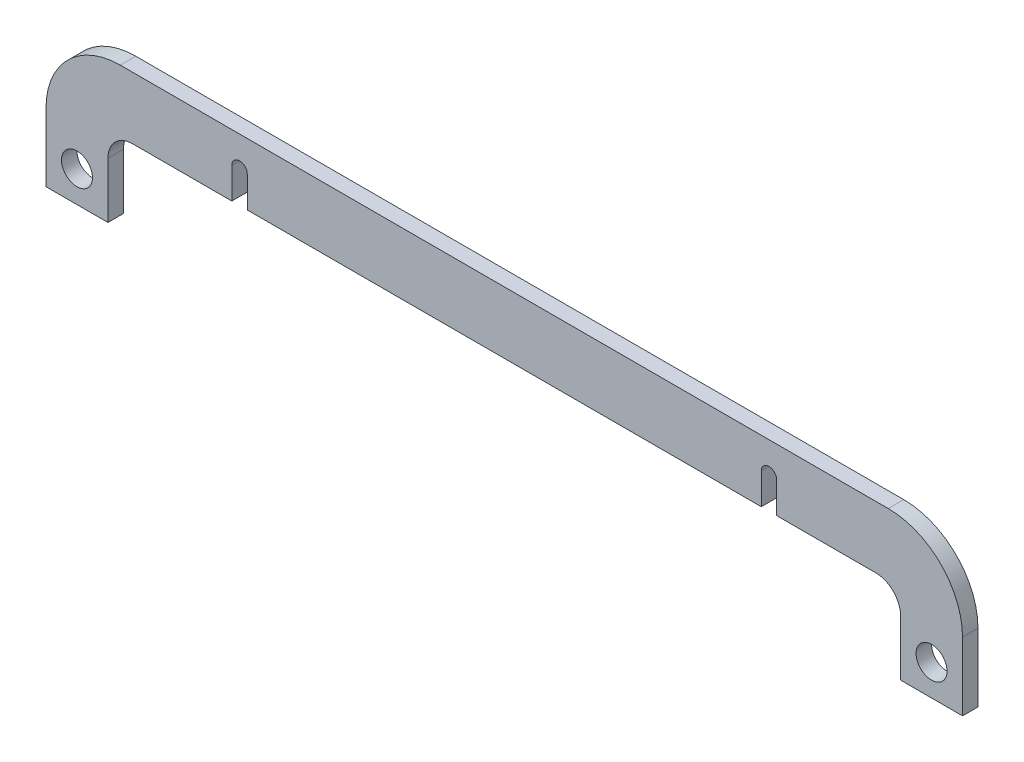
ISO-10303-21;
HEADER;
FILE_DESCRIPTION(('STEP AP214'),'2;1');
FILE_NAME('part.step','',(''),(''),'','','');
FILE_SCHEMA(('AUTOMOTIVE_DESIGN { 1 0 10303 214 1 1 1 1 }'));
ENDSEC;
DATA;
#1=APPLICATION_CONTEXT('core data for automotive mechanical design processes');
#2=APPLICATION_PROTOCOL_DEFINITION('international standard','automotive_design',2000,#1);
#3=PRODUCT_CONTEXT('',#1,'mechanical');
#4=PRODUCT('Part','Part','',(#3));
#5=PRODUCT_RELATED_PRODUCT_CATEGORY('part','',(#4));
#6=PRODUCT_DEFINITION_FORMATION('','',#4);
#7=PRODUCT_DEFINITION_CONTEXT('part definition',#1,'design');
#8=PRODUCT_DEFINITION('design','',#6,#7);
#9=PRODUCT_DEFINITION_SHAPE('','',#8);
#10=(LENGTH_UNIT() NAMED_UNIT(*) SI_UNIT(.MILLI.,.METRE.));
#11=(NAMED_UNIT(*) PLANE_ANGLE_UNIT() SI_UNIT($,.RADIAN.));
#12=(NAMED_UNIT(*) SI_UNIT($,.STERADIAN.) SOLID_ANGLE_UNIT());
#13=UNCERTAINTY_MEASURE_WITH_UNIT(LENGTH_MEASURE(1.E-05),#10,'distance_accuracy_value','');
#14=(GEOMETRIC_REPRESENTATION_CONTEXT(3) GLOBAL_UNCERTAINTY_ASSIGNED_CONTEXT((#13)) GLOBAL_UNIT_ASSIGNED_CONTEXT((#10,
#11,#12)) REPRESENTATION_CONTEXT('',''));
#15=CARTESIAN_POINT('',(0.,0.,0.));
#16=DIRECTION('',(0.,0.,1.));
#17=DIRECTION('',(1.,0.,0.));
#18=AXIS2_PLACEMENT_3D('',#15,#16,#17);
#19=CARTESIAN_POINT('',(27.14625,31.75,1.5875));
#20=DIRECTION('',(0.,0.,1.));
#21=DIRECTION('',(1.,0.,0.));
#22=AXIS2_PLACEMENT_3D('',#19,#20,#21);
#23=PLANE('',#22);
#24=CARTESIAN_POINT('',(-43.815,23.495,1.5875));
#25=DIRECTION('',(0.,0.,1.));
#26=DIRECTION('',(1.,0.,0.));
#27=AXIS2_PLACEMENT_3D('',#24,#25,#26);
#28=CIRCLE('',#27,1.5875);
#29=CARTESIAN_POINT('',(-42.2275,23.495,1.5875));
#30=VERTEX_POINT('',#29);
#31=EDGE_CURVE('E219',#30,#30,#28,.T.);
#32=ORIENTED_EDGE('',*,*,#31,.F.);
#33=EDGE_LOOP('',(#32));
#34=FACE_BOUND('',#33,.T.);
#35=DIRECTION('',(1.,0.,0.));
#36=VECTOR('',#35,1.);
#37=CARTESIAN_POINT('',(-26.3525,28.575,1.5875));
#38=LINE('',#37,#36);
#39=CARTESIAN_POINT('',(-26.3525,28.575,1.5875));
#40=VERTEX_POINT('',#39);
#41=CARTESIAN_POINT('',(26.3525,28.575,1.5875));
#42=VERTEX_POINT('',#41);
#43=EDGE_CURVE('E273',#40,#42,#38,.T.);
#44=ORIENTED_EDGE('',*,*,#43,.T.);
#45=DIRECTION('',(0.,1.,0.));
#46=VECTOR('',#45,1.);
#47=CARTESIAN_POINT('',(26.3525,28.575,1.5875));
#48=LINE('',#47,#46);
#49=CARTESIAN_POINT('',(26.3525,31.75,1.5875));
#50=VERTEX_POINT('',#49);
#51=EDGE_CURVE('E137',#42,#50,#48,.T.);
#52=ORIENTED_EDGE('',*,*,#51,.T.);
#53=CARTESIAN_POINT('',(27.14625,31.75,1.5875));
#54=DIRECTION('',(0.,0.,-1.));
#55=DIRECTION('',(1.,0.,0.));
#56=AXIS2_PLACEMENT_3D('',#53,#54,#55);
#57=CIRCLE('',#56,0.793749999999999);
#58=CARTESIAN_POINT('',(27.94,31.75,1.5875));
#59=VERTEX_POINT('',#58);
#60=EDGE_CURVE('E342',#50,#59,#57,.T.);
#61=ORIENTED_EDGE('',*,*,#60,.T.);
#62=DIRECTION('',(0.,-1.,0.));
#63=VECTOR('',#62,1.);
#64=CARTESIAN_POINT('',(27.94,28.575,1.5875));
#65=LINE('',#64,#63);
#66=CARTESIAN_POINT('',(27.94,28.575,1.5875));
#67=VERTEX_POINT('',#66);
#68=EDGE_CURVE('E362',#59,#67,#65,.T.);
#69=ORIENTED_EDGE('',*,*,#68,.T.);
#70=DIRECTION('',(1.,0.,0.));
#71=VECTOR('',#70,1.);
#72=CARTESIAN_POINT('',(27.94,28.575,1.5875));
#73=LINE('',#72,#71);
#74=CARTESIAN_POINT('',(38.1,28.575,1.5875));
#75=VERTEX_POINT('',#74);
#76=EDGE_CURVE('E358',#67,#75,#73,.T.);
#77=ORIENTED_EDGE('',*,*,#76,.T.);
#78=CARTESIAN_POINT('',(38.1,26.035,1.5875));
#79=DIRECTION('',(0.,0.,-1.));
#80=DIRECTION('',(1.,0.,0.));
#81=AXIS2_PLACEMENT_3D('',#78,#79,#80);
#82=CIRCLE('',#81,2.54);
#83=CARTESIAN_POINT('',(40.64,26.035,1.5875));
#84=VERTEX_POINT('',#83);
#85=EDGE_CURVE('E361',#75,#84,#82,.T.);
#86=ORIENTED_EDGE('',*,*,#85,.T.);
#87=DIRECTION('',(0.,-1.,0.));
#88=VECTOR('',#87,1.);
#89=CARTESIAN_POINT('',(40.64,20.32,1.5875));
#90=LINE('',#89,#88);
#91=CARTESIAN_POINT('',(40.64,20.32,1.5875));
#92=VERTEX_POINT('',#91);
#93=EDGE_CURVE('E366',#84,#92,#90,.T.);
#94=ORIENTED_EDGE('',*,*,#93,.T.);
#95=DIRECTION('',(1.,0.,0.));
#96=VECTOR('',#95,1.);
#97=CARTESIAN_POINT('',(40.64,20.32,1.5875));
#98=LINE('',#97,#96);
#99=CARTESIAN_POINT('',(46.99,20.32,1.5875));
#100=VERTEX_POINT('',#99);
#101=EDGE_CURVE('E373',#92,#100,#98,.T.);
#102=ORIENTED_EDGE('',*,*,#101,.T.);
#103=DIRECTION('',(0.,1.,0.));
#104=VECTOR('',#103,1.);
#105=CARTESIAN_POINT('',(46.99,27.305,1.5875));
#106=LINE('',#105,#104);
#107=CARTESIAN_POINT('',(46.99,27.305,1.5875));
#108=VERTEX_POINT('',#107);
#109=EDGE_CURVE('E376',#100,#108,#106,.T.);
#110=ORIENTED_EDGE('',*,*,#109,.T.);
#111=CARTESIAN_POINT('',(39.37,27.305,1.5875));
#112=DIRECTION('',(0.,0.,1.));
#113=DIRECTION('',(1.,0.,0.));
#114=AXIS2_PLACEMENT_3D('',#111,#112,#113);
#115=CIRCLE('',#114,7.62);
#116=CARTESIAN_POINT('',(39.37,34.925,1.5875));
#117=VERTEX_POINT('',#116);
#118=EDGE_CURVE('E379',#108,#117,#115,.T.);
#119=ORIENTED_EDGE('',*,*,#118,.T.);
#120=DIRECTION('',(-1.,0.,0.));
#121=VECTOR('',#120,1.);
#122=CARTESIAN_POINT('',(-39.37,34.925,1.5875));
#123=LINE('',#122,#121);
#124=CARTESIAN_POINT('',(-39.37,34.925,1.5875));
#125=VERTEX_POINT('',#124);
#126=EDGE_CURVE('E382',#117,#125,#123,.T.);
#127=ORIENTED_EDGE('',*,*,#126,.T.);
#128=CARTESIAN_POINT('',(-39.37,27.305,1.5875));
#129=DIRECTION('',(0.,0.,1.));
#130=DIRECTION('',(1.,0.,0.));
#131=AXIS2_PLACEMENT_3D('',#128,#129,#130);
#132=CIRCLE('',#131,7.62);
#133=CARTESIAN_POINT('',(-46.99,27.305,1.5875));
#134=VERTEX_POINT('',#133);
#135=EDGE_CURVE('E385',#125,#134,#132,.T.);
#136=ORIENTED_EDGE('',*,*,#135,.T.);
#137=DIRECTION('',(0.,-1.,0.));
#138=VECTOR('',#137,1.);
#139=CARTESIAN_POINT('',(-46.99,27.305,1.5875));
#140=LINE('',#139,#138);
#141=CARTESIAN_POINT('',(-46.99,20.32,1.5875));
#142=VERTEX_POINT('',#141);
#143=EDGE_CURVE('E388',#134,#142,#140,.T.);
#144=ORIENTED_EDGE('',*,*,#143,.T.);
#145=DIRECTION('',(1.,0.,0.));
#146=VECTOR('',#145,1.);
#147=CARTESIAN_POINT('',(-46.99,20.32,1.5875));
#148=LINE('',#147,#146);
#149=CARTESIAN_POINT('',(-40.64,20.32,1.5875));
#150=VERTEX_POINT('',#149);
#151=EDGE_CURVE('E391',#142,#150,#148,.T.);
#152=ORIENTED_EDGE('',*,*,#151,.T.);
#153=DIRECTION('',(0.,1.,0.));
#154=VECTOR('',#153,1.);
#155=CARTESIAN_POINT('',(-40.64,20.32,1.5875));
#156=LINE('',#155,#154);
#157=CARTESIAN_POINT('',(-40.64,26.035,1.5875));
#158=VERTEX_POINT('',#157);
#159=EDGE_CURVE('E394',#150,#158,#156,.T.);
#160=ORIENTED_EDGE('',*,*,#159,.T.);
#161=CARTESIAN_POINT('',(-38.1,26.035,1.5875));
#162=DIRECTION('',(0.,0.,-1.));
#163=DIRECTION('',(-1.,0.,0.));
#164=AXIS2_PLACEMENT_3D('',#161,#162,#163);
#165=CIRCLE('',#164,2.54);
#166=CARTESIAN_POINT('',(-38.1,28.575,1.5875));
#167=VERTEX_POINT('',#166);
#168=EDGE_CURVE('E397',#158,#167,#165,.T.);
#169=ORIENTED_EDGE('',*,*,#168,.T.);
#170=DIRECTION('',(1.,0.,0.));
#171=VECTOR('',#170,1.);
#172=CARTESIAN_POINT('',(-38.1,28.575,1.5875));
#173=LINE('',#172,#171);
#174=CARTESIAN_POINT('',(-27.94,28.575,1.5875));
#175=VERTEX_POINT('',#174);
#176=EDGE_CURVE('E192',#167,#175,#173,.T.);
#177=ORIENTED_EDGE('',*,*,#176,.T.);
#178=DIRECTION('',(0.,1.,0.));
#179=VECTOR('',#178,1.);
#180=CARTESIAN_POINT('',(-27.94,28.575,1.5875));
#181=LINE('',#180,#179);
#182=CARTESIAN_POINT('',(-27.94,31.75,1.5875));
#183=VERTEX_POINT('',#182);
#184=EDGE_CURVE('E186',#175,#183,#181,.T.);
#185=ORIENTED_EDGE('',*,*,#184,.T.);
#186=CARTESIAN_POINT('',(-27.14625,31.75,1.5875));
#187=DIRECTION('',(0.,0.,-1.));
#188=DIRECTION('',(1.,0.,0.));
#189=AXIS2_PLACEMENT_3D('',#186,#187,#188);
#190=CIRCLE('',#189,0.793749999999999);
#191=CARTESIAN_POINT('',(-26.3525,31.75,1.5875));
#192=VERTEX_POINT('',#191);
#193=EDGE_CURVE('E190',#183,#192,#190,.T.);
#194=ORIENTED_EDGE('',*,*,#193,.T.);
#195=DIRECTION('',(0.,-1.,0.));
#196=VECTOR('',#195,1.);
#197=CARTESIAN_POINT('',(-26.3525,28.575,1.5875));
#198=LINE('',#197,#196);
#199=EDGE_CURVE('E58',#192,#40,#198,.T.);
#200=ORIENTED_EDGE('',*,*,#199,.T.);
#201=EDGE_LOOP('',(#44,#52,#61,#69,#77,#86,#94,#102,#110,#119,#127,#136,#144,#152,#160,#169,
#177,#185,#194,#200));
#202=FACE_BOUND('',#201,.T.);
#203=CARTESIAN_POINT('',(43.815,23.495,1.5875));
#204=DIRECTION('',(0.,0.,1.));
#205=DIRECTION('',(1.,0.,0.));
#206=AXIS2_PLACEMENT_3D('',#203,#204,#205);
#207=CIRCLE('',#206,1.5875);
#208=CARTESIAN_POINT('',(45.4025,23.495,1.5875));
#209=VERTEX_POINT('',#208);
#210=EDGE_CURVE('E442',#209,#209,#207,.T.);
#211=ORIENTED_EDGE('',*,*,#210,.F.);
#212=EDGE_LOOP('',(#211));
#213=FACE_BOUND('',#212,.T.);
#214=ADVANCED_FACE('F40',(#34,#202,#213),#23,.T.);
#215=CARTESIAN_POINT('',(27.14625,31.75,0.));
#216=DIRECTION('',(0.,0.,1.));
#217=DIRECTION('',(1.,0.,0.));
#218=AXIS2_PLACEMENT_3D('',#215,#216,#217);
#219=PLANE('',#218);
#220=CARTESIAN_POINT('',(-43.815,23.495,0.));
#221=DIRECTION('',(0.,0.,1.));
#222=DIRECTION('',(1.,0.,0.));
#223=AXIS2_PLACEMENT_3D('',#220,#221,#222);
#224=CIRCLE('',#223,1.5875);
#225=CARTESIAN_POINT('',(-42.2275,23.495,0.));
#226=VERTEX_POINT('',#225);
#227=EDGE_CURVE('E449',#226,#226,#224,.T.);
#228=ORIENTED_EDGE('',*,*,#227,.T.);
#229=EDGE_LOOP('',(#228));
#230=FACE_BOUND('',#229,.T.);
#231=DIRECTION('',(1.,0.,0.));
#232=VECTOR('',#231,1.);
#233=CARTESIAN_POINT('',(-26.3525,28.575,0.));
#234=LINE('',#233,#232);
#235=CARTESIAN_POINT('',(-26.3525,28.575,0.));
#236=VERTEX_POINT('',#235);
#237=CARTESIAN_POINT('',(26.3525,28.575,0.));
#238=VERTEX_POINT('',#237);
#239=EDGE_CURVE('E214',#236,#238,#234,.T.);
#240=ORIENTED_EDGE('',*,*,#239,.F.);
#241=DIRECTION('',(0.,-1.,0.));
#242=VECTOR('',#241,1.);
#243=CARTESIAN_POINT('',(-26.3525,28.575,0.));
#244=LINE('',#243,#242);
#245=CARTESIAN_POINT('',(-26.3525,31.75,0.));
#246=VERTEX_POINT('',#245);
#247=EDGE_CURVE('E129',#246,#236,#244,.T.);
#248=ORIENTED_EDGE('',*,*,#247,.F.);
#249=CARTESIAN_POINT('',(-27.14625,31.75,0.));
#250=DIRECTION('',(0.,0.,-1.));
#251=DIRECTION('',(1.,0.,0.));
#252=AXIS2_PLACEMENT_3D('',#249,#250,#251);
#253=CIRCLE('',#252,0.793749999999999);
#254=CARTESIAN_POINT('',(-27.94,31.75,0.));
#255=VERTEX_POINT('',#254);
#256=EDGE_CURVE('E123',#255,#246,#253,.T.);
#257=ORIENTED_EDGE('',*,*,#256,.F.);
#258=DIRECTION('',(0.,1.,0.));
#259=VECTOR('',#258,1.);
#260=CARTESIAN_POINT('',(-27.94,28.575,0.));
#261=LINE('',#260,#259);
#262=CARTESIAN_POINT('',(-27.94,28.575,0.));
#263=VERTEX_POINT('',#262);
#264=EDGE_CURVE('E201',#263,#255,#261,.T.);
#265=ORIENTED_EDGE('',*,*,#264,.F.);
#266=DIRECTION('',(1.,0.,0.));
#267=VECTOR('',#266,1.);
#268=CARTESIAN_POINT('',(-38.1,28.575,0.));
#269=LINE('',#268,#267);
#270=CARTESIAN_POINT('',(-38.1,28.575,0.));
#271=VERTEX_POINT('',#270);
#272=EDGE_CURVE('E264',#271,#263,#269,.T.);
#273=ORIENTED_EDGE('',*,*,#272,.F.);
#274=CARTESIAN_POINT('',(-38.1,26.035,0.));
#275=DIRECTION('',(0.,0.,-1.));
#276=DIRECTION('',(-1.,0.,0.));
#277=AXIS2_PLACEMENT_3D('',#274,#275,#276);
#278=CIRCLE('',#277,2.54);
#279=CARTESIAN_POINT('',(-40.64,26.035,0.));
#280=VERTEX_POINT('',#279);
#281=EDGE_CURVE('E261',#280,#271,#278,.T.);
#282=ORIENTED_EDGE('',*,*,#281,.F.);
#283=DIRECTION('',(0.,1.,0.));
#284=VECTOR('',#283,1.);
#285=CARTESIAN_POINT('',(-40.64,20.32,0.));
#286=LINE('',#285,#284);
#287=CARTESIAN_POINT('',(-40.64,20.32,0.));
#288=VERTEX_POINT('',#287);
#289=EDGE_CURVE('E258',#288,#280,#286,.T.);
#290=ORIENTED_EDGE('',*,*,#289,.F.);
#291=DIRECTION('',(1.,0.,0.));
#292=VECTOR('',#291,1.);
#293=CARTESIAN_POINT('',(-46.99,20.32,0.));
#294=LINE('',#293,#292);
#295=CARTESIAN_POINT('',(-46.99,20.32,0.));
#296=VERTEX_POINT('',#295);
#297=EDGE_CURVE('E255',#296,#288,#294,.T.);
#298=ORIENTED_EDGE('',*,*,#297,.F.);
#299=DIRECTION('',(0.,-1.,0.));
#300=VECTOR('',#299,1.);
#301=CARTESIAN_POINT('',(-46.99,27.305,0.));
#302=LINE('',#301,#300);
#303=CARTESIAN_POINT('',(-46.99,27.305,0.));
#304=VERTEX_POINT('',#303);
#305=EDGE_CURVE('E252',#304,#296,#302,.T.);
#306=ORIENTED_EDGE('',*,*,#305,.F.);
#307=CARTESIAN_POINT('',(-39.37,27.305,0.));
#308=DIRECTION('',(0.,0.,1.));
#309=DIRECTION('',(1.,0.,0.));
#310=AXIS2_PLACEMENT_3D('',#307,#308,#309);
#311=CIRCLE('',#310,7.62);
#312=CARTESIAN_POINT('',(-39.37,34.925,0.));
#313=VERTEX_POINT('',#312);
#314=EDGE_CURVE('E249',#313,#304,#311,.T.);
#315=ORIENTED_EDGE('',*,*,#314,.F.);
#316=DIRECTION('',(-1.,0.,0.));
#317=VECTOR('',#316,1.);
#318=CARTESIAN_POINT('',(-39.37,34.925,0.));
#319=LINE('',#318,#317);
#320=CARTESIAN_POINT('',(39.37,34.925,0.));
#321=VERTEX_POINT('',#320);
#322=EDGE_CURVE('E246',#321,#313,#319,.T.);
#323=ORIENTED_EDGE('',*,*,#322,.F.);
#324=CARTESIAN_POINT('',(39.37,27.305,0.));
#325=DIRECTION('',(0.,0.,1.));
#326=DIRECTION('',(1.,0.,0.));
#327=AXIS2_PLACEMENT_3D('',#324,#325,#326);
#328=CIRCLE('',#327,7.62);
#329=CARTESIAN_POINT('',(46.99,27.305,0.));
#330=VERTEX_POINT('',#329);
#331=EDGE_CURVE('E243',#330,#321,#328,.T.);
#332=ORIENTED_EDGE('',*,*,#331,.F.);
#333=DIRECTION('',(0.,1.,0.));
#334=VECTOR('',#333,1.);
#335=CARTESIAN_POINT('',(46.99,27.305,0.));
#336=LINE('',#335,#334);
#337=CARTESIAN_POINT('',(46.99,20.32,0.));
#338=VERTEX_POINT('',#337);
#339=EDGE_CURVE('E240',#338,#330,#336,.T.);
#340=ORIENTED_EDGE('',*,*,#339,.F.);
#341=DIRECTION('',(1.,0.,0.));
#342=VECTOR('',#341,1.);
#343=CARTESIAN_POINT('',(40.64,20.32,0.));
#344=LINE('',#343,#342);
#345=CARTESIAN_POINT('',(40.64,20.32,0.));
#346=VERTEX_POINT('',#345);
#347=EDGE_CURVE('E237',#346,#338,#344,.T.);
#348=ORIENTED_EDGE('',*,*,#347,.F.);
#349=DIRECTION('',(0.,-1.,0.));
#350=VECTOR('',#349,1.);
#351=CARTESIAN_POINT('',(40.64,20.32,0.));
#352=LINE('',#351,#350);
#353=CARTESIAN_POINT('',(40.64,26.035,0.));
#354=VERTEX_POINT('',#353);
#355=EDGE_CURVE('E234',#354,#346,#352,.T.);
#356=ORIENTED_EDGE('',*,*,#355,.F.);
#357=CARTESIAN_POINT('',(38.1,26.035,0.));
#358=DIRECTION('',(0.,0.,-1.));
#359=DIRECTION('',(1.,0.,0.));
#360=AXIS2_PLACEMENT_3D('',#357,#358,#359);
#361=CIRCLE('',#360,2.54);
#362=CARTESIAN_POINT('',(38.1,28.575,0.));
#363=VERTEX_POINT('',#362);
#364=EDGE_CURVE('E231',#363,#354,#361,.T.);
#365=ORIENTED_EDGE('',*,*,#364,.F.);
#366=DIRECTION('',(1.,0.,0.));
#367=VECTOR('',#366,1.);
#368=CARTESIAN_POINT('',(27.94,28.575,0.));
#369=LINE('',#368,#367);
#370=CARTESIAN_POINT('',(27.94,28.575,0.));
#371=VERTEX_POINT('',#370);
#372=EDGE_CURVE('E228',#371,#363,#369,.T.);
#373=ORIENTED_EDGE('',*,*,#372,.F.);
#374=DIRECTION('',(0.,-1.,0.));
#375=VECTOR('',#374,1.);
#376=CARTESIAN_POINT('',(27.94,28.575,0.));
#377=LINE('',#376,#375);
#378=CARTESIAN_POINT('',(27.94,31.75,0.));
#379=VERTEX_POINT('',#378);
#380=EDGE_CURVE('E225',#379,#371,#377,.T.);
#381=ORIENTED_EDGE('',*,*,#380,.F.);
#382=CARTESIAN_POINT('',(27.14625,31.75,0.));
#383=DIRECTION('',(0.,0.,-1.));
#384=DIRECTION('',(1.,0.,0.));
#385=AXIS2_PLACEMENT_3D('',#382,#383,#384);
#386=CIRCLE('',#385,0.793749999999999);
#387=CARTESIAN_POINT('',(26.3525,31.75,0.));
#388=VERTEX_POINT('',#387);
#389=EDGE_CURVE('E222',#388,#379,#386,.T.);
#390=ORIENTED_EDGE('',*,*,#389,.F.);
#391=DIRECTION('',(0.,1.,0.));
#392=VECTOR('',#391,1.);
#393=CARTESIAN_POINT('',(26.3525,28.575,0.));
#394=LINE('',#393,#392);
#395=EDGE_CURVE('E218',#238,#388,#394,.T.);
#396=ORIENTED_EDGE('',*,*,#395,.F.);
#397=EDGE_LOOP('',(#240,#248,#257,#265,#273,#282,#290,#298,#306,#315,#323,#332,#340,#348,#356,
#365,#373,#381,#390,#396));
#398=FACE_BOUND('',#397,.T.);
#399=CARTESIAN_POINT('',(43.815,23.495,0.));
#400=DIRECTION('',(0.,0.,1.));
#401=DIRECTION('',(1.,0.,0.));
#402=AXIS2_PLACEMENT_3D('',#399,#400,#401);
#403=CIRCLE('',#402,1.5875);
#404=CARTESIAN_POINT('',(45.4025,23.495,0.));
#405=VERTEX_POINT('',#404);
#406=EDGE_CURVE('E445',#405,#405,#403,.T.);
#407=ORIENTED_EDGE('',*,*,#406,.T.);
#408=EDGE_LOOP('',(#407));
#409=FACE_BOUND('',#408,.T.);
#410=ADVANCED_FACE('F346',(#230,#398,#409),#219,.F.);
#411=CARTESIAN_POINT('',(-26.3525,28.575,1.5875));
#412=DIRECTION('',(0.,1.,0.));
#413=DIRECTION('',(0.,0.,1.));
#414=AXIS2_PLACEMENT_3D('',#411,#412,#413);
#415=PLANE('',#414);
#416=ORIENTED_EDGE('',*,*,#239,.T.);
#417=DIRECTION('',(0.,0.,-1.));
#418=VECTOR('',#417,1.);
#419=CARTESIAN_POINT('',(26.3525,28.575,1.5875));
#420=LINE('',#419,#418);
#421=EDGE_CURVE('E11',#42,#238,#420,.T.);
#422=ORIENTED_EDGE('',*,*,#421,.F.);
#423=ORIENTED_EDGE('',*,*,#43,.F.);
#424=DIRECTION('',(0.,0.,-1.));
#425=VECTOR('',#424,1.);
#426=CARTESIAN_POINT('',(-26.3525,28.575,1.5875));
#427=LINE('',#426,#425);
#428=EDGE_CURVE('E210',#40,#236,#427,.T.);
#429=ORIENTED_EDGE('',*,*,#428,.T.);
#430=EDGE_LOOP('',(#416,#422,#423,#429));
#431=FACE_BOUND('',#430,.T.);
#432=ADVANCED_FACE('F42',(#431),#415,.F.);
#433=CARTESIAN_POINT('',(26.3525,28.575,1.5875));
#434=DIRECTION('',(-1.,0.,0.));
#435=DIRECTION('',(0.,0.,1.));
#436=AXIS2_PLACEMENT_3D('',#433,#434,#435);
#437=PLANE('',#436);
#438=ORIENTED_EDGE('',*,*,#395,.T.);
#439=DIRECTION('',(0.,0.,-1.));
#440=VECTOR('',#439,1.);
#441=CARTESIAN_POINT('',(26.3525,31.75,1.5875));
#442=LINE('',#441,#440);
#443=EDGE_CURVE('E50',#50,#388,#442,.T.);
#444=ORIENTED_EDGE('',*,*,#443,.F.);
#445=ORIENTED_EDGE('',*,*,#51,.F.);
#446=ORIENTED_EDGE('',*,*,#421,.T.);
#447=EDGE_LOOP('',(#438,#444,#445,#446));
#448=FACE_BOUND('',#447,.T.);
#449=ADVANCED_FACE('F607',(#448),#437,.F.);
#450=CARTESIAN_POINT('',(27.14625,31.75,1.5875));
#451=DIRECTION('',(0.,0.,-1.));
#452=DIRECTION('',(-1.,0.,0.));
#453=AXIS2_PLACEMENT_3D('',#450,#451,#452);
#454=CYLINDRICAL_SURFACE('',#453,0.793749999999999);
#455=ORIENTED_EDGE('',*,*,#389,.T.);
#456=DIRECTION('',(0.,0.,-1.));
#457=VECTOR('',#456,1.);
#458=CARTESIAN_POINT('',(27.94,31.75,1.5875));
#459=LINE('',#458,#457);
#460=EDGE_CURVE('E332',#59,#379,#459,.T.);
#461=ORIENTED_EDGE('',*,*,#460,.F.);
#462=ORIENTED_EDGE('',*,*,#60,.F.);
#463=ORIENTED_EDGE('',*,*,#443,.T.);
#464=EDGE_LOOP('',(#455,#461,#462,#463));
#465=FACE_BOUND('',#464,.T.);
#466=ADVANCED_FACE('F340',(#465),#454,.F.);
#467=CARTESIAN_POINT('',(27.94,28.575,1.5875));
#468=DIRECTION('',(1.,0.,0.));
#469=DIRECTION('',(0.,1.,0.));
#470=AXIS2_PLACEMENT_3D('',#467,#468,#469);
#471=PLANE('',#470);
#472=ORIENTED_EDGE('',*,*,#380,.T.);
#473=DIRECTION('',(0.,0.,-1.));
#474=VECTOR('',#473,1.);
#475=CARTESIAN_POINT('',(27.94,28.575,1.5875));
#476=LINE('',#475,#474);
#477=EDGE_CURVE('E328',#67,#371,#476,.T.);
#478=ORIENTED_EDGE('',*,*,#477,.F.);
#479=ORIENTED_EDGE('',*,*,#68,.F.);
#480=ORIENTED_EDGE('',*,*,#460,.T.);
#481=EDGE_LOOP('',(#472,#478,#479,#480));
#482=FACE_BOUND('',#481,.T.);
#483=ADVANCED_FACE('F352',(#482),#471,.F.);
#484=CARTESIAN_POINT('',(27.94,28.575,1.5875));
#485=DIRECTION('',(0.,1.,0.));
#486=DIRECTION('',(0.,0.,1.));
#487=AXIS2_PLACEMENT_3D('',#484,#485,#486);
#488=PLANE('',#487);
#489=ORIENTED_EDGE('',*,*,#372,.T.);
#490=DIRECTION('',(0.,0.,-1.));
#491=VECTOR('',#490,1.);
#492=CARTESIAN_POINT('',(38.1,28.575,1.5875));
#493=LINE('',#492,#491);
#494=EDGE_CURVE('E324',#75,#363,#493,.T.);
#495=ORIENTED_EDGE('',*,*,#494,.F.);
#496=ORIENTED_EDGE('',*,*,#76,.F.);
#497=ORIENTED_EDGE('',*,*,#477,.T.);
#498=EDGE_LOOP('',(#489,#495,#496,#497));
#499=FACE_BOUND('',#498,.T.);
#500=ADVANCED_FACE('F356',(#499),#488,.F.);
#501=CARTESIAN_POINT('',(38.1,26.035,1.5875));
#502=DIRECTION('',(0.,0.,-1.));
#503=DIRECTION('',(-1.,0.,0.));
#504=AXIS2_PLACEMENT_3D('',#501,#502,#503);
#505=CYLINDRICAL_SURFACE('',#504,2.54);
#506=ORIENTED_EDGE('',*,*,#364,.T.);
#507=DIRECTION('',(0.,0.,-1.));
#508=VECTOR('',#507,1.);
#509=CARTESIAN_POINT('',(40.64,26.035,1.5875));
#510=LINE('',#509,#508);
#511=EDGE_CURVE('E320',#84,#354,#510,.T.);
#512=ORIENTED_EDGE('',*,*,#511,.F.);
#513=ORIENTED_EDGE('',*,*,#85,.F.);
#514=ORIENTED_EDGE('',*,*,#494,.T.);
#515=EDGE_LOOP('',(#506,#512,#513,#514));
#516=FACE_BOUND('',#515,.T.);
#517=ADVANCED_FACE('F576',(#516),#505,.F.);
#518=CARTESIAN_POINT('',(40.64,20.32,1.5875));
#519=DIRECTION('',(1.,0.,0.));
#520=DIRECTION('',(0.,0.,-1.));
#521=AXIS2_PLACEMENT_3D('',#518,#519,#520);
#522=PLANE('',#521);
#523=ORIENTED_EDGE('',*,*,#355,.T.);
#524=DIRECTION('',(0.,0.,-1.));
#525=VECTOR('',#524,1.);
#526=CARTESIAN_POINT('',(40.64,20.32,1.5875));
#527=LINE('',#526,#525);
#528=EDGE_CURVE('E316',#92,#346,#527,.T.);
#529=ORIENTED_EDGE('',*,*,#528,.F.);
#530=ORIENTED_EDGE('',*,*,#93,.F.);
#531=ORIENTED_EDGE('',*,*,#511,.T.);
#532=EDGE_LOOP('',(#523,#529,#530,#531));
#533=FACE_BOUND('',#532,.T.);
#534=ADVANCED_FACE('F567',(#533),#522,.F.);
#535=CARTESIAN_POINT('',(40.64,20.32,1.5875));
#536=DIRECTION('',(0.,1.,0.));
#537=DIRECTION('',(0.,0.,1.));
#538=AXIS2_PLACEMENT_3D('',#535,#536,#537);
#539=PLANE('',#538);
#540=ORIENTED_EDGE('',*,*,#347,.T.);
#541=DIRECTION('',(0.,0.,-1.));
#542=VECTOR('',#541,1.);
#543=CARTESIAN_POINT('',(46.99,20.32,1.5875));
#544=LINE('',#543,#542);
#545=EDGE_CURVE('E312',#100,#338,#544,.T.);
#546=ORIENTED_EDGE('',*,*,#545,.F.);
#547=ORIENTED_EDGE('',*,*,#101,.F.);
#548=ORIENTED_EDGE('',*,*,#528,.T.);
#549=EDGE_LOOP('',(#540,#546,#547,#548));
#550=FACE_BOUND('',#549,.T.);
#551=ADVANCED_FACE('F558',(#550),#539,.F.);
#552=CARTESIAN_POINT('',(46.99,27.305,1.5875));
#553=DIRECTION('',(-1.,0.,0.));
#554=DIRECTION('',(0.,-1.,0.));
#555=AXIS2_PLACEMENT_3D('',#552,#553,#554);
#556=PLANE('',#555);
#557=ORIENTED_EDGE('',*,*,#339,.T.);
#558=DIRECTION('',(0.,0.,-1.));
#559=VECTOR('',#558,1.);
#560=CARTESIAN_POINT('',(46.99,27.305,1.5875));
#561=LINE('',#560,#559);
#562=EDGE_CURVE('E308',#108,#330,#561,.T.);
#563=ORIENTED_EDGE('',*,*,#562,.F.);
#564=ORIENTED_EDGE('',*,*,#109,.F.);
#565=ORIENTED_EDGE('',*,*,#545,.T.);
#566=EDGE_LOOP('',(#557,#563,#564,#565));
#567=FACE_BOUND('',#566,.T.);
#568=ADVANCED_FACE('F549',(#567),#556,.F.);
#569=CARTESIAN_POINT('',(39.37,27.305,1.5875));
#570=DIRECTION('',(0.,0.,-1.));
#571=DIRECTION('',(-1.,0.,0.));
#572=AXIS2_PLACEMENT_3D('',#569,#570,#571);
#573=CYLINDRICAL_SURFACE('',#572,7.62);
#574=ORIENTED_EDGE('',*,*,#331,.T.);
#575=DIRECTION('',(0.,0.,-1.));
#576=VECTOR('',#575,1.);
#577=CARTESIAN_POINT('',(39.37,34.925,1.5875));
#578=LINE('',#577,#576);
#579=EDGE_CURVE('E304',#117,#321,#578,.T.);
#580=ORIENTED_EDGE('',*,*,#579,.F.);
#581=ORIENTED_EDGE('',*,*,#118,.F.);
#582=ORIENTED_EDGE('',*,*,#562,.T.);
#583=EDGE_LOOP('',(#574,#580,#581,#582));
#584=FACE_BOUND('',#583,.T.);
#585=ADVANCED_FACE('F540',(#584),#573,.T.);
#586=CARTESIAN_POINT('',(-39.37,34.925,1.5875));
#587=DIRECTION('',(0.,-1.,0.));
#588=DIRECTION('',(0.,0.,-1.));
#589=AXIS2_PLACEMENT_3D('',#586,#587,#588);
#590=PLANE('',#589);
#591=ORIENTED_EDGE('',*,*,#322,.T.);
#592=DIRECTION('',(0.,0.,-1.));
#593=VECTOR('',#592,1.);
#594=CARTESIAN_POINT('',(-39.37,34.925,1.5875));
#595=LINE('',#594,#593);
#596=EDGE_CURVE('E300',#125,#313,#595,.T.);
#597=ORIENTED_EDGE('',*,*,#596,.F.);
#598=ORIENTED_EDGE('',*,*,#126,.F.);
#599=ORIENTED_EDGE('',*,*,#579,.T.);
#600=EDGE_LOOP('',(#591,#597,#598,#599));
#601=FACE_BOUND('',#600,.T.);
#602=ADVANCED_FACE('F531',(#601),#590,.F.);
#603=CARTESIAN_POINT('',(-39.37,27.305,1.5875));
#604=DIRECTION('',(0.,0.,-1.));
#605=DIRECTION('',(-1.,0.,0.));
#606=AXIS2_PLACEMENT_3D('',#603,#604,#605);
#607=CYLINDRICAL_SURFACE('',#606,7.62);
#608=ORIENTED_EDGE('',*,*,#314,.T.);
#609=DIRECTION('',(0.,0.,-1.));
#610=VECTOR('',#609,1.);
#611=CARTESIAN_POINT('',(-46.99,27.305,1.5875));
#612=LINE('',#611,#610);
#613=EDGE_CURVE('E296',#134,#304,#612,.T.);
#614=ORIENTED_EDGE('',*,*,#613,.F.);
#615=ORIENTED_EDGE('',*,*,#135,.F.);
#616=ORIENTED_EDGE('',*,*,#596,.T.);
#617=EDGE_LOOP('',(#608,#614,#615,#616));
#618=FACE_BOUND('',#617,.T.);
#619=ADVANCED_FACE('F522',(#618),#607,.T.);
#620=CARTESIAN_POINT('',(-46.99,27.305,1.5875));
#621=DIRECTION('',(1.,0.,0.));
#622=DIRECTION('',(0.,1.,0.));
#623=AXIS2_PLACEMENT_3D('',#620,#621,#622);
#624=PLANE('',#623);
#625=ORIENTED_EDGE('',*,*,#305,.T.);
#626=DIRECTION('',(0.,0.,-1.));
#627=VECTOR('',#626,1.);
#628=CARTESIAN_POINT('',(-46.99,20.32,1.5875));
#629=LINE('',#628,#627);
#630=EDGE_CURVE('E292',#142,#296,#629,.T.);
#631=ORIENTED_EDGE('',*,*,#630,.F.);
#632=ORIENTED_EDGE('',*,*,#143,.F.);
#633=ORIENTED_EDGE('',*,*,#613,.T.);
#634=EDGE_LOOP('',(#625,#631,#632,#633));
#635=FACE_BOUND('',#634,.T.);
#636=ADVANCED_FACE('F513',(#635),#624,.F.);
#637=CARTESIAN_POINT('',(-46.99,20.32,1.5875));
#638=DIRECTION('',(0.,1.,0.));
#639=DIRECTION('',(0.,0.,1.));
#640=AXIS2_PLACEMENT_3D('',#637,#638,#639);
#641=PLANE('',#640);
#642=ORIENTED_EDGE('',*,*,#297,.T.);
#643=DIRECTION('',(0.,0.,-1.));
#644=VECTOR('',#643,1.);
#645=CARTESIAN_POINT('',(-40.64,20.32,1.5875));
#646=LINE('',#645,#644);
#647=EDGE_CURVE('E288',#150,#288,#646,.T.);
#648=ORIENTED_EDGE('',*,*,#647,.F.);
#649=ORIENTED_EDGE('',*,*,#151,.F.);
#650=ORIENTED_EDGE('',*,*,#630,.T.);
#651=EDGE_LOOP('',(#642,#648,#649,#650));
#652=FACE_BOUND('',#651,.T.);
#653=ADVANCED_FACE('F504',(#652),#641,.F.);
#654=CARTESIAN_POINT('',(-40.64,20.32,1.5875));
#655=DIRECTION('',(-1.,0.,0.));
#656=DIRECTION('',(0.,0.,1.));
#657=AXIS2_PLACEMENT_3D('',#654,#655,#656);
#658=PLANE('',#657);
#659=ORIENTED_EDGE('',*,*,#289,.T.);
#660=DIRECTION('',(0.,0.,-1.));
#661=VECTOR('',#660,1.);
#662=CARTESIAN_POINT('',(-40.64,26.035,1.5875));
#663=LINE('',#662,#661);
#664=EDGE_CURVE('E284',#158,#280,#663,.T.);
#665=ORIENTED_EDGE('',*,*,#664,.F.);
#666=ORIENTED_EDGE('',*,*,#159,.F.);
#667=ORIENTED_EDGE('',*,*,#647,.T.);
#668=EDGE_LOOP('',(#659,#665,#666,#667));
#669=FACE_BOUND('',#668,.T.);
#670=ADVANCED_FACE('F496',(#669),#658,.F.);
#671=CARTESIAN_POINT('',(-38.1,26.035,1.5875));
#672=DIRECTION('',(0.,0.,-1.));
#673=DIRECTION('',(-1.,0.,0.));
#674=AXIS2_PLACEMENT_3D('',#671,#672,#673);
#675=CYLINDRICAL_SURFACE('',#674,2.54);
#676=ORIENTED_EDGE('',*,*,#281,.T.);
#677=DIRECTION('',(0.,0.,-1.));
#678=VECTOR('',#677,1.);
#679=CARTESIAN_POINT('',(-38.1,28.575,1.5875));
#680=LINE('',#679,#678);
#681=EDGE_CURVE('E280',#167,#271,#680,.T.);
#682=ORIENTED_EDGE('',*,*,#681,.F.);
#683=ORIENTED_EDGE('',*,*,#168,.F.);
#684=ORIENTED_EDGE('',*,*,#664,.T.);
#685=EDGE_LOOP('',(#676,#682,#683,#684));
#686=FACE_BOUND('',#685,.T.);
#687=ADVANCED_FACE('F405',(#686),#675,.F.);
#688=CARTESIAN_POINT('',(-38.1,28.575,1.5875));
#689=DIRECTION('',(0.,1.,0.));
#690=DIRECTION('',(0.,0.,1.));
#691=AXIS2_PLACEMENT_3D('',#688,#689,#690);
#692=PLANE('',#691);
#693=ORIENTED_EDGE('',*,*,#272,.T.);
#694=DIRECTION('',(0.,0.,-1.));
#695=VECTOR('',#694,1.);
#696=CARTESIAN_POINT('',(-27.94,28.575,1.5875));
#697=LINE('',#696,#695);
#698=EDGE_CURVE('E203',#175,#263,#697,.T.);
#699=ORIENTED_EDGE('',*,*,#698,.F.);
#700=ORIENTED_EDGE('',*,*,#176,.F.);
#701=ORIENTED_EDGE('',*,*,#681,.T.);
#702=EDGE_LOOP('',(#693,#699,#700,#701));
#703=FACE_BOUND('',#702,.T.);
#704=ADVANCED_FACE('F409',(#703),#692,.F.);
#705=CARTESIAN_POINT('',(-27.94,28.575,1.5875));
#706=DIRECTION('',(-1.,0.,0.));
#707=DIRECTION('',(0.,0.,1.));
#708=AXIS2_PLACEMENT_3D('',#705,#706,#707);
#709=PLANE('',#708);
#710=ORIENTED_EDGE('',*,*,#264,.T.);
#711=DIRECTION('',(0.,0.,-1.));
#712=VECTOR('',#711,1.);
#713=CARTESIAN_POINT('',(-27.94,31.75,1.5875));
#714=LINE('',#713,#712);
#715=EDGE_CURVE('E198',#183,#255,#714,.T.);
#716=ORIENTED_EDGE('',*,*,#715,.F.);
#717=ORIENTED_EDGE('',*,*,#184,.F.);
#718=ORIENTED_EDGE('',*,*,#698,.T.);
#719=EDGE_LOOP('',(#710,#716,#717,#718));
#720=FACE_BOUND('',#719,.T.);
#721=ADVANCED_FACE('F199',(#720),#709,.F.);
#722=CARTESIAN_POINT('',(-27.14625,31.75,1.5875));
#723=DIRECTION('',(0.,0.,-1.));
#724=DIRECTION('',(-1.,0.,0.));
#725=AXIS2_PLACEMENT_3D('',#722,#723,#724);
#726=CYLINDRICAL_SURFACE('',#725,0.793749999999999);
#727=ORIENTED_EDGE('',*,*,#256,.T.);
#728=DIRECTION('',(0.,0.,-1.));
#729=VECTOR('',#728,1.);
#730=CARTESIAN_POINT('',(-26.3525,31.75,1.5875));
#731=LINE('',#730,#729);
#732=EDGE_CURVE('E204',#192,#246,#731,.T.);
#733=ORIENTED_EDGE('',*,*,#732,.F.);
#734=ORIENTED_EDGE('',*,*,#193,.F.);
#735=ORIENTED_EDGE('',*,*,#715,.T.);
#736=EDGE_LOOP('',(#727,#733,#734,#735));
#737=FACE_BOUND('',#736,.T.);
#738=ADVANCED_FACE('F206',(#737),#726,.F.);
#739=CARTESIAN_POINT('',(-26.3525,28.575,1.5875));
#740=DIRECTION('',(1.,0.,0.));
#741=DIRECTION('',(0.,0.,-1.));
#742=AXIS2_PLACEMENT_3D('',#739,#740,#741);
#743=PLANE('',#742);
#744=ORIENTED_EDGE('',*,*,#247,.T.);
#745=ORIENTED_EDGE('',*,*,#428,.F.);
#746=ORIENTED_EDGE('',*,*,#199,.F.);
#747=ORIENTED_EDGE('',*,*,#732,.T.);
#748=EDGE_LOOP('',(#744,#745,#746,#747));
#749=FACE_BOUND('',#748,.T.);
#750=ADVANCED_FACE('F413',(#749),#743,.F.);
#751=CARTESIAN_POINT('',(-43.815,23.495,1.5875));
#752=DIRECTION('',(0.,0.,-1.));
#753=DIRECTION('',(-1.,0.,0.));
#754=AXIS2_PLACEMENT_3D('',#751,#752,#753);
#755=CYLINDRICAL_SURFACE('',#754,1.5875);
#756=ORIENTED_EDGE('',*,*,#31,.T.);
#757=EDGE_LOOP('',(#756));
#758=FACE_BOUND('',#757,.T.);
#759=ORIENTED_EDGE('',*,*,#227,.F.);
#760=EDGE_LOOP('',(#759));
#761=FACE_BOUND('',#760,.T.);
#762=ADVANCED_FACE('F415',(#758,#761),#755,.F.);
#763=CARTESIAN_POINT('',(43.815,23.495,1.5875));
#764=DIRECTION('',(0.,0.,-1.));
#765=DIRECTION('',(-1.,0.,0.));
#766=AXIS2_PLACEMENT_3D('',#763,#764,#765);
#767=CYLINDRICAL_SURFACE('',#766,1.5875);
#768=ORIENTED_EDGE('',*,*,#210,.T.);
#769=EDGE_LOOP('',(#768));
#770=FACE_BOUND('',#769,.T.);
#771=ORIENTED_EDGE('',*,*,#406,.F.);
#772=EDGE_LOOP('',(#771));
#773=FACE_BOUND('',#772,.T.);
#774=ADVANCED_FACE('F421',(#770,#773),#767,.F.);
#775=CLOSED_SHELL('',(#214,#410,#432,#449,#466,#483,#500,#517,#534,#551,#568,#585,#602,#619,
#636,#653,#670,#687,#704,#721,#738,#750,#762,#774));
#776=MANIFOLD_SOLID_BREP('B2',#775);
#777=ADVANCED_BREP_SHAPE_REPRESENTATION('',(#18,#776),#14);
#778=SHAPE_DEFINITION_REPRESENTATION(#9,#777);
ENDSEC;
END-ISO-10303-21;
